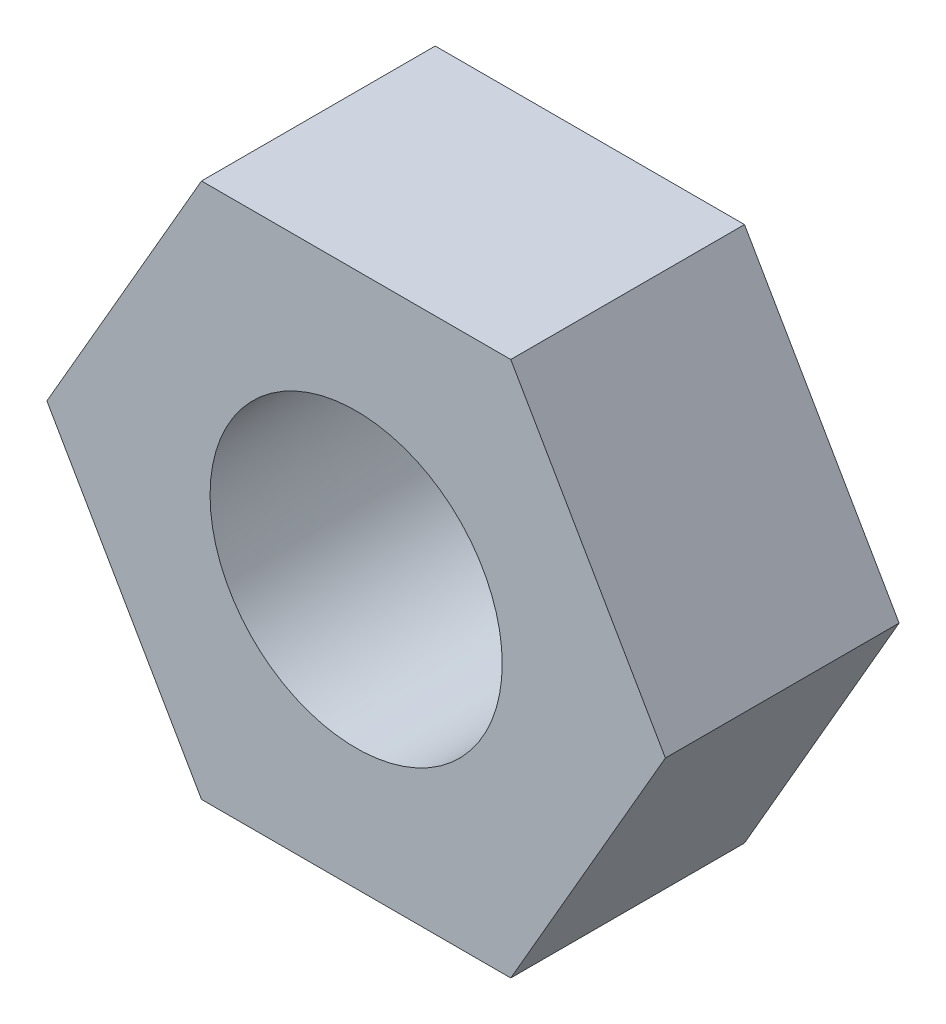
ISO-10303-21;
HEADER;
FILE_DESCRIPTION(('STEP AP214'),'2;1');
FILE_NAME('part.step','',(''),(''),'','','');
FILE_SCHEMA(('AUTOMOTIVE_DESIGN { 1 0 10303 214 1 1 1 1 }'));
ENDSEC;
DATA;
#1=APPLICATION_CONTEXT('core data for automotive mechanical design processes');
#2=APPLICATION_PROTOCOL_DEFINITION('international standard','automotive_design',2000,#1);
#3=PRODUCT_CONTEXT('',#1,'mechanical');
#4=PRODUCT('Part','Part','',(#3));
#5=PRODUCT_RELATED_PRODUCT_CATEGORY('part','',(#4));
#6=PRODUCT_DEFINITION_FORMATION('','',#4);
#7=PRODUCT_DEFINITION_CONTEXT('part definition',#1,'design');
#8=PRODUCT_DEFINITION('design','',#6,#7);
#9=PRODUCT_DEFINITION_SHAPE('','',#8);
#10=(LENGTH_UNIT() NAMED_UNIT(*) SI_UNIT(.MILLI.,.METRE.));
#11=(NAMED_UNIT(*) PLANE_ANGLE_UNIT() SI_UNIT($,.RADIAN.));
#12=(NAMED_UNIT(*) SI_UNIT($,.STERADIAN.) SOLID_ANGLE_UNIT());
#13=UNCERTAINTY_MEASURE_WITH_UNIT(LENGTH_MEASURE(1.E-05),#10,'distance_accuracy_value','');
#14=(GEOMETRIC_REPRESENTATION_CONTEXT(3) GLOBAL_UNCERTAINTY_ASSIGNED_CONTEXT((#13)) GLOBAL_UNIT_ASSIGNED_CONTEXT((#10,
#11,#12)) REPRESENTATION_CONTEXT('',''));
#15=CARTESIAN_POINT('',(0.,0.,0.));
#16=DIRECTION('',(0.,0.,1.));
#17=DIRECTION('',(1.,0.,0.));
#18=AXIS2_PLACEMENT_3D('',#15,#16,#17);
#19=CARTESIAN_POINT('',(0.,0.,2.4));
#20=DIRECTION('',(0.,0.,1.));
#21=DIRECTION('',(1.,0.,0.));
#22=AXIS2_PLACEMENT_3D('',#19,#20,#21);
#23=PLANE('',#22);
#24=DIRECTION('',(0.5,0.866025403784439,0.));
#25=VECTOR('',#24,1.);
#26=CARTESIAN_POINT('',(1.58771324027147,-2.75,2.4));
#27=LINE('',#26,#25);
#28=CARTESIAN_POINT('',(1.58771324027147,-2.75,2.4));
#29=VERTEX_POINT('',#28);
#30=CARTESIAN_POINT('',(3.17542648054294,0.,2.4));
#31=VERTEX_POINT('',#30);
#32=EDGE_CURVE('E140',#29,#31,#27,.T.);
#33=ORIENTED_EDGE('',*,*,#32,.T.);
#34=DIRECTION('',(-0.5,0.866025403784439,0.));
#35=VECTOR('',#34,1.);
#36=CARTESIAN_POINT('',(3.17542648054294,0.,2.4));
#37=LINE('',#36,#35);
#38=CARTESIAN_POINT('',(1.58771324027147,2.75,2.4));
#39=VERTEX_POINT('',#38);
#40=EDGE_CURVE('E93',#31,#39,#37,.T.);
#41=ORIENTED_EDGE('',*,*,#40,.T.);
#42=DIRECTION('',(-1.,0.,0.));
#43=VECTOR('',#42,1.);
#44=CARTESIAN_POINT('',(1.58771324027147,2.75,2.4));
#45=LINE('',#44,#43);
#46=CARTESIAN_POINT('',(-1.58771324027147,2.75,2.4));
#47=VERTEX_POINT('',#46);
#48=EDGE_CURVE('E108',#39,#47,#45,.T.);
#49=ORIENTED_EDGE('',*,*,#48,.T.);
#50=DIRECTION('',(-0.5,-0.866025403784438,0.));
#51=VECTOR('',#50,1.);
#52=CARTESIAN_POINT('',(-1.58771324027147,2.75,2.4));
#53=LINE('',#52,#51);
#54=CARTESIAN_POINT('',(-3.17542648054294,0.,2.4));
#55=VERTEX_POINT('',#54);
#56=EDGE_CURVE('E105',#47,#55,#53,.T.);
#57=ORIENTED_EDGE('',*,*,#56,.T.);
#58=DIRECTION('',(0.5,-0.866025403784439,0.));
#59=VECTOR('',#58,1.);
#60=CARTESIAN_POINT('',(-3.17542648054294,0.,2.4));
#61=LINE('',#60,#59);
#62=CARTESIAN_POINT('',(-1.58771324027147,-2.75,2.4));
#63=VERTEX_POINT('',#62);
#64=EDGE_CURVE('E106',#55,#63,#61,.T.);
#65=ORIENTED_EDGE('',*,*,#64,.T.);
#66=DIRECTION('',(1.,0.,0.));
#67=VECTOR('',#66,1.);
#68=CARTESIAN_POINT('',(-1.58771324027147,-2.75,2.4));
#69=LINE('',#68,#67);
#70=EDGE_CURVE('E59',#63,#29,#69,.T.);
#71=ORIENTED_EDGE('',*,*,#70,.T.);
#72=EDGE_LOOP('',(#33,#41,#49,#57,#65,#71));
#73=FACE_BOUND('',#72,.T.);
#74=CARTESIAN_POINT('',(0.,0.,2.4));
#75=DIRECTION('',(0.,0.,1.));
#76=DIRECTION('',(1.,0.,0.));
#77=AXIS2_PLACEMENT_3D('',#74,#75,#76);
#78=CIRCLE('',#77,1.5);
#79=CARTESIAN_POINT('',(1.5,0.,2.4));
#80=VERTEX_POINT('',#79);
#81=EDGE_CURVE('E129',#80,#80,#78,.T.);
#82=ORIENTED_EDGE('',*,*,#81,.F.);
#83=EDGE_LOOP('',(#82));
#84=FACE_BOUND('',#83,.T.);
#85=ADVANCED_FACE('F41',(#73,#84),#23,.T.);
#86=CARTESIAN_POINT('',(0.,0.,0.));
#87=DIRECTION('',(0.,0.,1.));
#88=DIRECTION('',(1.,0.,0.));
#89=AXIS2_PLACEMENT_3D('',#86,#87,#88);
#90=PLANE('',#89);
#91=DIRECTION('',(0.5,0.866025403784439,0.));
#92=VECTOR('',#91,1.);
#93=CARTESIAN_POINT('',(1.58771324027147,-2.75,0.));
#94=LINE('',#93,#92);
#95=CARTESIAN_POINT('',(1.58771324027147,-2.75,0.));
#96=VERTEX_POINT('',#95);
#97=CARTESIAN_POINT('',(3.17542648054294,0.,0.));
#98=VERTEX_POINT('',#97);
#99=EDGE_CURVE('E126',#96,#98,#94,.T.);
#100=ORIENTED_EDGE('',*,*,#99,.F.);
#101=DIRECTION('',(1.,0.,0.));
#102=VECTOR('',#101,1.);
#103=CARTESIAN_POINT('',(-1.58771324027147,-2.75,0.));
#104=LINE('',#103,#102);
#105=CARTESIAN_POINT('',(-1.58771324027147,-2.75,0.));
#106=VERTEX_POINT('',#105);
#107=EDGE_CURVE('E89',#106,#96,#104,.T.);
#108=ORIENTED_EDGE('',*,*,#107,.F.);
#109=DIRECTION('',(0.5,-0.866025403784439,0.));
#110=VECTOR('',#109,1.);
#111=CARTESIAN_POINT('',(-3.17542648054294,0.,0.));
#112=LINE('',#111,#110);
#113=CARTESIAN_POINT('',(-3.17542648054294,0.,0.));
#114=VERTEX_POINT('',#113);
#115=EDGE_CURVE('E81',#114,#106,#112,.T.);
#116=ORIENTED_EDGE('',*,*,#115,.F.);
#117=DIRECTION('',(-0.5,-0.866025403784438,0.));
#118=VECTOR('',#117,1.);
#119=CARTESIAN_POINT('',(-1.58771324027147,2.75,0.));
#120=LINE('',#119,#118);
#121=CARTESIAN_POINT('',(-1.58771324027147,2.75,0.));
#122=VERTEX_POINT('',#121);
#123=EDGE_CURVE('E116',#122,#114,#120,.T.);
#124=ORIENTED_EDGE('',*,*,#123,.F.);
#125=DIRECTION('',(-1.,0.,0.));
#126=VECTOR('',#125,1.);
#127=CARTESIAN_POINT('',(1.58771324027147,2.75,0.));
#128=LINE('',#127,#126);
#129=CARTESIAN_POINT('',(1.58771324027147,2.75,0.));
#130=VERTEX_POINT('',#129);
#131=EDGE_CURVE('E134',#130,#122,#128,.T.);
#132=ORIENTED_EDGE('',*,*,#131,.F.);
#133=DIRECTION('',(-0.5,0.866025403784439,0.));
#134=VECTOR('',#133,1.);
#135=CARTESIAN_POINT('',(3.17542648054294,0.,0.));
#136=LINE('',#135,#134);
#137=EDGE_CURVE('E128',#98,#130,#136,.T.);
#138=ORIENTED_EDGE('',*,*,#137,.F.);
#139=EDGE_LOOP('',(#100,#108,#116,#124,#132,#138));
#140=FACE_BOUND('',#139,.T.);
#141=CARTESIAN_POINT('',(0.,0.,0.));
#142=DIRECTION('',(0.,0.,1.));
#143=DIRECTION('',(1.,0.,0.));
#144=AXIS2_PLACEMENT_3D('',#141,#142,#143);
#145=CIRCLE('',#144,1.5);
#146=CARTESIAN_POINT('',(1.5,0.,0.));
#147=VERTEX_POINT('',#146);
#148=EDGE_CURVE('E229',#147,#147,#145,.T.);
#149=ORIENTED_EDGE('',*,*,#148,.T.);
#150=EDGE_LOOP('',(#149));
#151=FACE_BOUND('',#150,.T.);
#152=ADVANCED_FACE('F146',(#140,#151),#90,.F.);
#153=CARTESIAN_POINT('',(1.58771324027147,-2.75,2.4));
#154=DIRECTION('',(-0.866025403784439,0.5,0.));
#155=DIRECTION('',(-0.5,-0.866025403784439,0.));
#156=AXIS2_PLACEMENT_3D('',#153,#154,#155);
#157=PLANE('',#156);
#158=ORIENTED_EDGE('',*,*,#99,.T.);
#159=DIRECTION('',(0.,0.,-1.));
#160=VECTOR('',#159,1.);
#161=CARTESIAN_POINT('',(3.17542648054294,0.,2.4));
#162=LINE('',#161,#160);
#163=EDGE_CURVE('E11',#31,#98,#162,.T.);
#164=ORIENTED_EDGE('',*,*,#163,.F.);
#165=ORIENTED_EDGE('',*,*,#32,.F.);
#166=DIRECTION('',(0.,0.,-1.));
#167=VECTOR('',#166,1.);
#168=CARTESIAN_POINT('',(1.58771324027147,-2.75,2.4));
#169=LINE('',#168,#167);
#170=EDGE_CURVE('E125',#29,#96,#169,.T.);
#171=ORIENTED_EDGE('',*,*,#170,.T.);
#172=EDGE_LOOP('',(#158,#164,#165,#171));
#173=FACE_BOUND('',#172,.T.);
#174=ADVANCED_FACE('F43',(#173),#157,.F.);
#175=CARTESIAN_POINT('',(3.17542648054294,0.,2.4));
#176=DIRECTION('',(-0.866025403784439,-0.5,0.));
#177=DIRECTION('',(0.5,-0.866025403784439,0.));
#178=AXIS2_PLACEMENT_3D('',#175,#176,#177);
#179=PLANE('',#178);
#180=ORIENTED_EDGE('',*,*,#137,.T.);
#181=DIRECTION('',(0.,0.,-1.));
#182=VECTOR('',#181,1.);
#183=CARTESIAN_POINT('',(1.58771324027147,2.75,2.4));
#184=LINE('',#183,#182);
#185=EDGE_CURVE('E49',#39,#130,#184,.T.);
#186=ORIENTED_EDGE('',*,*,#185,.F.);
#187=ORIENTED_EDGE('',*,*,#40,.F.);
#188=ORIENTED_EDGE('',*,*,#163,.T.);
#189=EDGE_LOOP('',(#180,#186,#187,#188));
#190=FACE_BOUND('',#189,.T.);
#191=ADVANCED_FACE('F171',(#190),#179,.F.);
#192=CARTESIAN_POINT('',(1.58771324027147,2.75,2.4));
#193=DIRECTION('',(0.,-1.,0.));
#194=DIRECTION('',(1.,0.,0.));
#195=AXIS2_PLACEMENT_3D('',#192,#193,#194);
#196=PLANE('',#195);
#197=ORIENTED_EDGE('',*,*,#131,.T.);
#198=DIRECTION('',(0.,0.,-1.));
#199=VECTOR('',#198,1.);
#200=CARTESIAN_POINT('',(-1.58771324027147,2.75,2.4));
#201=LINE('',#200,#199);
#202=EDGE_CURVE('E120',#47,#122,#201,.T.);
#203=ORIENTED_EDGE('',*,*,#202,.F.);
#204=ORIENTED_EDGE('',*,*,#48,.F.);
#205=ORIENTED_EDGE('',*,*,#185,.T.);
#206=EDGE_LOOP('',(#197,#203,#204,#205));
#207=FACE_BOUND('',#206,.T.);
#208=ADVANCED_FACE('F141',(#207),#196,.F.);
#209=CARTESIAN_POINT('',(-1.58771324027147,2.75,2.4));
#210=DIRECTION('',(0.866025403784439,-0.5,0.));
#211=DIRECTION('',(0.5,0.866025403784439,0.));
#212=AXIS2_PLACEMENT_3D('',#209,#210,#211);
#213=PLANE('',#212);
#214=ORIENTED_EDGE('',*,*,#123,.T.);
#215=DIRECTION('',(0.,0.,-1.));
#216=VECTOR('',#215,1.);
#217=CARTESIAN_POINT('',(-3.17542648054294,0.,2.4));
#218=LINE('',#217,#216);
#219=EDGE_CURVE('E113',#55,#114,#218,.T.);
#220=ORIENTED_EDGE('',*,*,#219,.F.);
#221=ORIENTED_EDGE('',*,*,#56,.F.);
#222=ORIENTED_EDGE('',*,*,#202,.T.);
#223=EDGE_LOOP('',(#214,#220,#221,#222));
#224=FACE_BOUND('',#223,.T.);
#225=ADVANCED_FACE('F112',(#224),#213,.F.);
#226=CARTESIAN_POINT('',(-3.17542648054294,0.,2.4));
#227=DIRECTION('',(0.866025403784439,0.5,0.));
#228=DIRECTION('',(-0.5,0.866025403784439,0.));
#229=AXIS2_PLACEMENT_3D('',#226,#227,#228);
#230=PLANE('',#229);
#231=ORIENTED_EDGE('',*,*,#115,.T.);
#232=DIRECTION('',(0.,0.,-1.));
#233=VECTOR('',#232,1.);
#234=CARTESIAN_POINT('',(-1.58771324027147,-2.75,2.4));
#235=LINE('',#234,#233);
#236=EDGE_CURVE('E117',#63,#106,#235,.T.);
#237=ORIENTED_EDGE('',*,*,#236,.F.);
#238=ORIENTED_EDGE('',*,*,#64,.F.);
#239=ORIENTED_EDGE('',*,*,#219,.T.);
#240=EDGE_LOOP('',(#231,#237,#238,#239));
#241=FACE_BOUND('',#240,.T.);
#242=ADVANCED_FACE('F119',(#241),#230,.F.);
#243=CARTESIAN_POINT('',(-1.58771324027147,-2.75,2.4));
#244=DIRECTION('',(0.,1.,0.));
#245=DIRECTION('',(-1.,0.,0.));
#246=AXIS2_PLACEMENT_3D('',#243,#244,#245);
#247=PLANE('',#246);
#248=ORIENTED_EDGE('',*,*,#107,.T.);
#249=ORIENTED_EDGE('',*,*,#170,.F.);
#250=ORIENTED_EDGE('',*,*,#70,.F.);
#251=ORIENTED_EDGE('',*,*,#236,.T.);
#252=EDGE_LOOP('',(#248,#249,#250,#251));
#253=FACE_BOUND('',#252,.T.);
#254=ADVANCED_FACE('F153',(#253),#247,.F.);
#255=CARTESIAN_POINT('',(0.,0.,2.4));
#256=DIRECTION('',(0.,0.,-1.));
#257=DIRECTION('',(-1.,0.,0.));
#258=AXIS2_PLACEMENT_3D('',#255,#256,#257);
#259=CYLINDRICAL_SURFACE('',#258,1.5);
#260=ORIENTED_EDGE('',*,*,#81,.T.);
#261=EDGE_LOOP('',(#260));
#262=FACE_BOUND('',#261,.T.);
#263=ORIENTED_EDGE('',*,*,#148,.F.);
#264=EDGE_LOOP('',(#263));
#265=FACE_BOUND('',#264,.T.);
#266=ADVANCED_FACE('F152',(#262,#265),#259,.F.);
#267=CLOSED_SHELL('',(#85,#152,#174,#191,#208,#225,#242,#254,#266));
#268=MANIFOLD_SOLID_BREP('B2',#267);
#269=ADVANCED_BREP_SHAPE_REPRESENTATION('',(#18,#268),#14);
#270=SHAPE_DEFINITION_REPRESENTATION(#9,#269);
ENDSEC;
END-ISO-10303-21;
